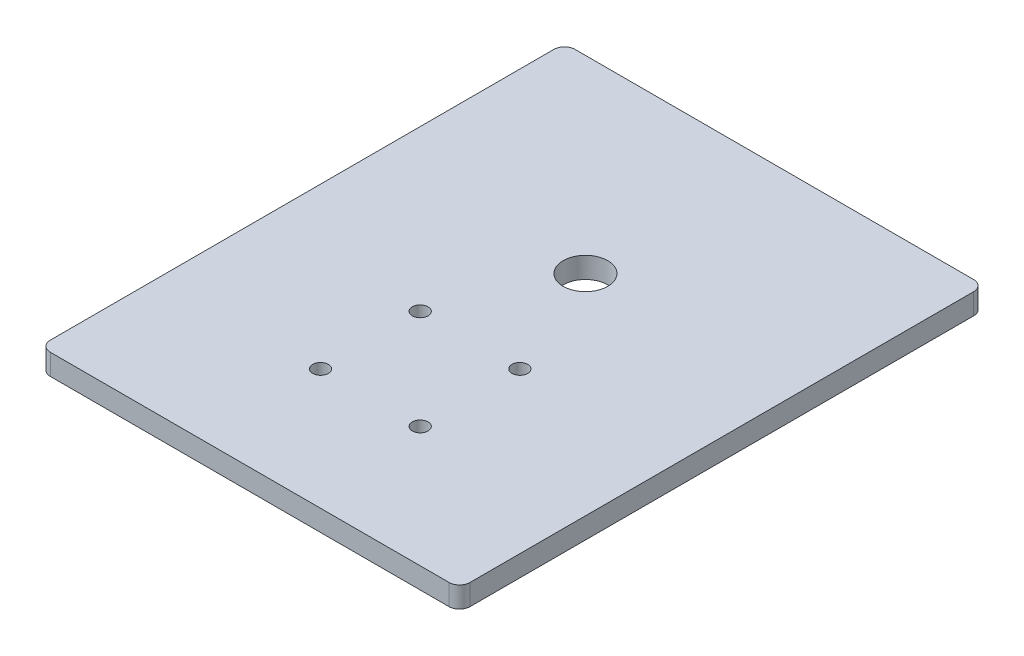
ISO-10303-21;
HEADER;
FILE_DESCRIPTION(('STEP AP214'),'2;1');
FILE_NAME('part.step','',(''),(''),'','','');
FILE_SCHEMA(('AUTOMOTIVE_DESIGN { 1 0 10303 214 1 1 1 1 }'));
ENDSEC;
DATA;
#1=APPLICATION_CONTEXT('core data for automotive mechanical design processes');
#2=APPLICATION_PROTOCOL_DEFINITION('international standard','automotive_design',2000,#1);
#3=PRODUCT_CONTEXT('',#1,'mechanical');
#4=PRODUCT('Part','Part','',(#3));
#5=PRODUCT_RELATED_PRODUCT_CATEGORY('part','',(#4));
#6=PRODUCT_DEFINITION_FORMATION('','',#4);
#7=PRODUCT_DEFINITION_CONTEXT('part definition',#1,'design');
#8=PRODUCT_DEFINITION('design','',#6,#7);
#9=PRODUCT_DEFINITION_SHAPE('','',#8);
#10=(LENGTH_UNIT() NAMED_UNIT(*) SI_UNIT(.MILLI.,.METRE.));
#11=(NAMED_UNIT(*) PLANE_ANGLE_UNIT() SI_UNIT($,.RADIAN.));
#12=(NAMED_UNIT(*) SI_UNIT($,.STERADIAN.) SOLID_ANGLE_UNIT());
#13=UNCERTAINTY_MEASURE_WITH_UNIT(LENGTH_MEASURE(1.E-05),#10,'distance_accuracy_value','');
#14=(GEOMETRIC_REPRESENTATION_CONTEXT(3) GLOBAL_UNCERTAINTY_ASSIGNED_CONTEXT((#13)) GLOBAL_UNIT_ASSIGNED_CONTEXT((#10,
#11,#12)) REPRESENTATION_CONTEXT('',''));
#15=CARTESIAN_POINT('',(0.,0.,0.));
#16=DIRECTION('',(0.,0.,1.));
#17=DIRECTION('',(1.,0.,0.));
#18=AXIS2_PLACEMENT_3D('',#15,#16,#17);
#19=CARTESIAN_POINT('',(-80.,-8.,0.));
#20=DIRECTION('',(-1.,0.,0.));
#21=DIRECTION('',(0.,0.,1.));
#22=AXIS2_PLACEMENT_3D('',#19,#20,#21);
#23=PLANE('',#22);
#24=DIRECTION('',(0.,0.,1.));
#25=VECTOR('',#24,1.);
#26=CARTESIAN_POINT('',(-80.,0.,0.));
#27=LINE('',#26,#25);
#28=CARTESIAN_POINT('',(-80.,0.,4.));
#29=VERTEX_POINT('',#28);
#30=CARTESIAN_POINT('',(-79.9999999999999,0.,196.));
#31=VERTEX_POINT('',#30);
#32=EDGE_CURVE('E109',#29,#31,#27,.T.);
#33=ORIENTED_EDGE('',*,*,#32,.F.);
#34=DIRECTION('',(0.,1.,0.));
#35=VECTOR('',#34,1.);
#36=CARTESIAN_POINT('',(-80.,-8.,4.));
#37=LINE('',#36,#35);
#38=CARTESIAN_POINT('',(-80.,-8.,4.));
#39=VERTEX_POINT('',#38);
#40=EDGE_CURVE('E11',#29,#39,#37,.F.);
#41=ORIENTED_EDGE('',*,*,#40,.T.);
#42=DIRECTION('',(0.,0.,1.));
#43=VECTOR('',#42,1.);
#44=CARTESIAN_POINT('',(-80.,-8.,0.));
#45=LINE('',#44,#43);
#46=CARTESIAN_POINT('',(-79.9999999999999,-8.,196.));
#47=VERTEX_POINT('',#46);
#48=EDGE_CURVE('E159',#39,#47,#45,.T.);
#49=ORIENTED_EDGE('',*,*,#48,.T.);
#50=DIRECTION('',(0.,1.,0.));
#51=VECTOR('',#50,1.);
#52=CARTESIAN_POINT('',(-79.9999999999999,-8.,196.));
#53=LINE('',#52,#51);
#54=EDGE_CURVE('E46',#47,#31,#53,.T.);
#55=ORIENTED_EDGE('',*,*,#54,.T.);
#56=EDGE_LOOP('',(#33,#41,#49,#55));
#57=FACE_BOUND('',#56,.T.);
#58=ADVANCED_FACE('F38',(#57),#23,.T.);
#59=CARTESIAN_POINT('',(-80.,-8.,0.));
#60=DIRECTION('',(0.,0.,-1.));
#61=DIRECTION('',(-1.,0.,0.));
#62=AXIS2_PLACEMENT_3D('',#59,#60,#61);
#63=PLANE('',#62);
#64=DIRECTION('',(-1.,0.,0.));
#65=VECTOR('',#64,1.);
#66=CARTESIAN_POINT('',(-80.,0.,0.));
#67=LINE('',#66,#65);
#68=CARTESIAN_POINT('',(76.,0.,0.));
#69=VERTEX_POINT('',#68);
#70=CARTESIAN_POINT('',(-76.,0.,0.));
#71=VERTEX_POINT('',#70);
#72=EDGE_CURVE('E134',#69,#71,#67,.T.);
#73=ORIENTED_EDGE('',*,*,#72,.F.);
#74=DIRECTION('',(0.,1.,0.));
#75=VECTOR('',#74,1.);
#76=CARTESIAN_POINT('',(76.,-8.,0.));
#77=LINE('',#76,#75);
#78=CARTESIAN_POINT('',(76.,-8.,0.));
#79=VERTEX_POINT('',#78);
#80=EDGE_CURVE('E60',#69,#79,#77,.F.);
#81=ORIENTED_EDGE('',*,*,#80,.T.);
#82=DIRECTION('',(-1.,0.,0.));
#83=VECTOR('',#82,1.);
#84=CARTESIAN_POINT('',(-80.,-8.,0.));
#85=LINE('',#84,#83);
#86=CARTESIAN_POINT('',(-76.,-8.,0.));
#87=VERTEX_POINT('',#86);
#88=EDGE_CURVE('E128',#79,#87,#85,.T.);
#89=ORIENTED_EDGE('',*,*,#88,.T.);
#90=DIRECTION('',(0.,1.,0.));
#91=VECTOR('',#90,1.);
#92=CARTESIAN_POINT('',(-76.,-8.,0.));
#93=LINE('',#92,#91);
#94=EDGE_CURVE('E153',#87,#71,#93,.T.);
#95=ORIENTED_EDGE('',*,*,#94,.T.);
#96=EDGE_LOOP('',(#73,#81,#89,#95));
#97=FACE_BOUND('',#96,.T.);
#98=ADVANCED_FACE('F195',(#97),#63,.T.);
#99=CARTESIAN_POINT('',(80.,-8.,0.));
#100=DIRECTION('',(1.,0.,0.));
#101=DIRECTION('',(0.,0.,-1.));
#102=AXIS2_PLACEMENT_3D('',#99,#100,#101);
#103=PLANE('',#102);
#104=DIRECTION('',(0.,0.,-1.));
#105=VECTOR('',#104,1.);
#106=CARTESIAN_POINT('',(80.,0.,0.));
#107=LINE('',#106,#105);
#108=CARTESIAN_POINT('',(80.,0.,196.));
#109=VERTEX_POINT('',#108);
#110=CARTESIAN_POINT('',(80.,0.,3.99999999999997));
#111=VERTEX_POINT('',#110);
#112=EDGE_CURVE('E124',#109,#111,#107,.T.);
#113=ORIENTED_EDGE('',*,*,#112,.F.);
#114=DIRECTION('',(0.,1.,0.));
#115=VECTOR('',#114,1.);
#116=CARTESIAN_POINT('',(80.,-8.,196.));
#117=LINE('',#116,#115);
#118=CARTESIAN_POINT('',(80.,-8.,196.));
#119=VERTEX_POINT('',#118);
#120=EDGE_CURVE('E145',#109,#119,#117,.F.);
#121=ORIENTED_EDGE('',*,*,#120,.T.);
#122=DIRECTION('',(0.,0.,-1.));
#123=VECTOR('',#122,1.);
#124=CARTESIAN_POINT('',(80.,-8.,0.));
#125=LINE('',#124,#123);
#126=CARTESIAN_POINT('',(80.,-8.,3.99999999999997));
#127=VERTEX_POINT('',#126);
#128=EDGE_CURVE('E131',#119,#127,#125,.T.);
#129=ORIENTED_EDGE('',*,*,#128,.T.);
#130=DIRECTION('',(0.,1.,0.));
#131=VECTOR('',#130,1.);
#132=CARTESIAN_POINT('',(80.,-8.,3.99999999999997));
#133=LINE('',#132,#131);
#134=EDGE_CURVE('E142',#127,#111,#133,.T.);
#135=ORIENTED_EDGE('',*,*,#134,.T.);
#136=EDGE_LOOP('',(#113,#121,#129,#135));
#137=FACE_BOUND('',#136,.T.);
#138=ADVANCED_FACE('F175',(#137),#103,.T.);
#139=CARTESIAN_POINT('',(-79.9999999999999,-8.,200.));
#140=DIRECTION('',(0.,0.,1.));
#141=DIRECTION('',(1.,0.,0.));
#142=AXIS2_PLACEMENT_3D('',#139,#140,#141);
#143=PLANE('',#142);
#144=DIRECTION('',(1.,0.,0.));
#145=VECTOR('',#144,1.);
#146=CARTESIAN_POINT('',(-79.9999999999999,-8.,200.));
#147=LINE('',#146,#145);
#148=CARTESIAN_POINT('',(-75.9999999999999,-8.,200.));
#149=VERTEX_POINT('',#148);
#150=CARTESIAN_POINT('',(76.,-8.,200.));
#151=VERTEX_POINT('',#150);
#152=EDGE_CURVE('E160',#149,#151,#147,.T.);
#153=ORIENTED_EDGE('',*,*,#152,.T.);
#154=DIRECTION('',(0.,1.,0.));
#155=VECTOR('',#154,1.);
#156=CARTESIAN_POINT('',(76.,-8.,200.));
#157=LINE('',#156,#155);
#158=CARTESIAN_POINT('',(76.,0.,200.));
#159=VERTEX_POINT('',#158);
#160=EDGE_CURVE('E115',#151,#159,#157,.T.);
#161=ORIENTED_EDGE('',*,*,#160,.T.);
#162=DIRECTION('',(1.,0.,0.));
#163=VECTOR('',#162,1.);
#164=CARTESIAN_POINT('',(-79.9999999999999,0.,200.));
#165=LINE('',#164,#163);
#166=CARTESIAN_POINT('',(-75.9999999999999,0.,200.));
#167=VERTEX_POINT('',#166);
#168=EDGE_CURVE('E107',#167,#159,#165,.T.);
#169=ORIENTED_EDGE('',*,*,#168,.F.);
#170=DIRECTION('',(0.,1.,0.));
#171=VECTOR('',#170,1.);
#172=CARTESIAN_POINT('',(-75.9999999999999,-8.,200.));
#173=LINE('',#172,#171);
#174=EDGE_CURVE('E121',#167,#149,#173,.F.);
#175=ORIENTED_EDGE('',*,*,#174,.T.);
#176=EDGE_LOOP('',(#153,#161,#169,#175));
#177=FACE_BOUND('',#176,.T.);
#178=ADVANCED_FACE('F120',(#177),#143,.T.);
#179=CARTESIAN_POINT('',(0.,-8.,0.));
#180=DIRECTION('',(0.,1.,0.));
#181=DIRECTION('',(0.,0.,1.));
#182=AXIS2_PLACEMENT_3D('',#179,#180,#181);
#183=PLANE('',#182);
#184=CARTESIAN_POINT('',(-18.9999999999996,-8.,154.));
#185=DIRECTION('',(0.,1.,0.));
#186=DIRECTION('',(0.,0.,1.));
#187=AXIS2_PLACEMENT_3D('',#184,#185,#186);
#188=CIRCLE('',#187,2.99999999999999);
#189=CARTESIAN_POINT('',(-18.9999999999996,-8.,157.));
#190=VERTEX_POINT('',#189);
#191=EDGE_CURVE('E251',#190,#190,#188,.T.);
#192=ORIENTED_EDGE('',*,*,#191,.T.);
#193=EDGE_LOOP('',(#192));
#194=FACE_BOUND('',#193,.T.);
#195=CARTESIAN_POINT('',(19.0000000000004,-8.,154.));
#196=DIRECTION('',(0.,1.,0.));
#197=DIRECTION('',(0.,0.,1.));
#198=AXIS2_PLACEMENT_3D('',#195,#196,#197);
#199=CIRCLE('',#198,2.99999999999999);
#200=CARTESIAN_POINT('',(19.0000000000004,-8.,157.));
#201=VERTEX_POINT('',#200);
#202=EDGE_CURVE('E241',#201,#201,#199,.T.);
#203=ORIENTED_EDGE('',*,*,#202,.T.);
#204=EDGE_LOOP('',(#203));
#205=FACE_BOUND('',#204,.T.);
#206=CARTESIAN_POINT('',(19.0000000000001,-8.,116.));
#207=DIRECTION('',(0.,1.,0.));
#208=DIRECTION('',(0.,0.,1.));
#209=AXIS2_PLACEMENT_3D('',#206,#207,#208);
#210=CIRCLE('',#209,2.99999999999999);
#211=CARTESIAN_POINT('',(19.0000000000001,-8.,119.));
#212=VERTEX_POINT('',#211);
#213=EDGE_CURVE('E236',#212,#212,#210,.T.);
#214=ORIENTED_EDGE('',*,*,#213,.T.);
#215=EDGE_LOOP('',(#214));
#216=FACE_BOUND('',#215,.T.);
#217=CARTESIAN_POINT('',(-19.,-8.,116.));
#218=DIRECTION('',(0.,1.,0.));
#219=DIRECTION('',(0.,0.,1.));
#220=AXIS2_PLACEMENT_3D('',#217,#218,#219);
#221=CIRCLE('',#220,3.);
#222=CARTESIAN_POINT('',(-19.,-8.,119.));
#223=VERTEX_POINT('',#222);
#224=EDGE_CURVE('E257',#223,#223,#221,.T.);
#225=ORIENTED_EDGE('',*,*,#224,.T.);
#226=EDGE_LOOP('',(#225));
#227=FACE_BOUND('',#226,.T.);
#228=CARTESIAN_POINT('',(0.,-8.,72.));
#229=DIRECTION('',(0.,1.,0.));
#230=DIRECTION('',(0.,0.,1.));
#231=AXIS2_PLACEMENT_3D('',#228,#229,#230);
#232=CIRCLE('',#231,8.50000000000001);
#233=CARTESIAN_POINT('',(0.,-8.,80.5));
#234=VERTEX_POINT('',#233);
#235=EDGE_CURVE('E170',#234,#234,#232,.T.);
#236=ORIENTED_EDGE('',*,*,#235,.T.);
#237=EDGE_LOOP('',(#236));
#238=FACE_BOUND('',#237,.T.);
#239=ORIENTED_EDGE('',*,*,#128,.F.);
#240=CARTESIAN_POINT('',(76.,-8.,196.));
#241=DIRECTION('',(0.,1.,0.));
#242=DIRECTION('',(0.,0.,1.));
#243=AXIS2_PLACEMENT_3D('',#240,#241,#242);
#244=CIRCLE('',#243,4.);
#245=EDGE_CURVE('E151',#119,#151,#244,.F.);
#246=ORIENTED_EDGE('',*,*,#245,.T.);
#247=ORIENTED_EDGE('',*,*,#152,.F.);
#248=CARTESIAN_POINT('',(-75.9999999999999,-8.,196.));
#249=DIRECTION('',(0.,1.,0.));
#250=DIRECTION('',(0.,0.,1.));
#251=AXIS2_PLACEMENT_3D('',#248,#249,#250);
#252=CIRCLE('',#251,4.);
#253=EDGE_CURVE('E127',#149,#47,#252,.F.);
#254=ORIENTED_EDGE('',*,*,#253,.T.);
#255=ORIENTED_EDGE('',*,*,#48,.F.);
#256=CARTESIAN_POINT('',(-76.,-8.,4.));
#257=DIRECTION('',(0.,1.,0.));
#258=DIRECTION('',(0.,0.,1.));
#259=AXIS2_PLACEMENT_3D('',#256,#257,#258);
#260=CIRCLE('',#259,4.);
#261=EDGE_CURVE('E53',#39,#87,#260,.F.);
#262=ORIENTED_EDGE('',*,*,#261,.T.);
#263=ORIENTED_EDGE('',*,*,#88,.F.);
#264=CARTESIAN_POINT('',(76.,-8.,3.99999999999997));
#265=DIRECTION('',(0.,1.,0.));
#266=DIRECTION('',(0.,0.,1.));
#267=AXIS2_PLACEMENT_3D('',#264,#265,#266);
#268=CIRCLE('',#267,4.);
#269=EDGE_CURVE('E149',#79,#127,#268,.F.);
#270=ORIENTED_EDGE('',*,*,#269,.T.);
#271=EDGE_LOOP('',(#239,#246,#247,#254,#255,#262,#263,#270));
#272=FACE_BOUND('',#271,.T.);
#273=ADVANCED_FACE('F181',(#194,#205,#216,#227,#238,#272),#183,.F.);
#274=CARTESIAN_POINT('',(0.,0.,0.));
#275=DIRECTION('',(0.,1.,0.));
#276=DIRECTION('',(0.,0.,1.));
#277=AXIS2_PLACEMENT_3D('',#274,#275,#276);
#278=PLANE('',#277);
#279=CARTESIAN_POINT('',(-18.9999999999996,0.,154.));
#280=DIRECTION('',(0.,1.,0.));
#281=DIRECTION('',(0.,0.,1.));
#282=AXIS2_PLACEMENT_3D('',#279,#280,#281);
#283=CIRCLE('',#282,2.99999999999999);
#284=CARTESIAN_POINT('',(-18.9999999999996,0.,157.));
#285=VERTEX_POINT('',#284);
#286=EDGE_CURVE('E254',#285,#285,#283,.T.);
#287=ORIENTED_EDGE('',*,*,#286,.F.);
#288=EDGE_LOOP('',(#287));
#289=FACE_BOUND('',#288,.T.);
#290=CARTESIAN_POINT('',(19.0000000000004,0.,154.));
#291=DIRECTION('',(0.,1.,0.));
#292=DIRECTION('',(0.,0.,1.));
#293=AXIS2_PLACEMENT_3D('',#290,#291,#292);
#294=CIRCLE('',#293,2.99999999999999);
#295=CARTESIAN_POINT('',(19.0000000000004,0.,157.));
#296=VERTEX_POINT('',#295);
#297=EDGE_CURVE('E246',#296,#296,#294,.T.);
#298=ORIENTED_EDGE('',*,*,#297,.F.);
#299=EDGE_LOOP('',(#298));
#300=FACE_BOUND('',#299,.T.);
#301=CARTESIAN_POINT('',(19.0000000000001,0.,116.));
#302=DIRECTION('',(0.,1.,0.));
#303=DIRECTION('',(0.,0.,1.));
#304=AXIS2_PLACEMENT_3D('',#301,#302,#303);
#305=CIRCLE('',#304,2.99999999999999);
#306=CARTESIAN_POINT('',(19.0000000000001,0.,119.));
#307=VERTEX_POINT('',#306);
#308=EDGE_CURVE('E239',#307,#307,#305,.T.);
#309=ORIENTED_EDGE('',*,*,#308,.F.);
#310=EDGE_LOOP('',(#309));
#311=FACE_BOUND('',#310,.T.);
#312=CARTESIAN_POINT('',(-19.,0.,116.));
#313=DIRECTION('',(0.,1.,0.));
#314=DIRECTION('',(0.,0.,1.));
#315=AXIS2_PLACEMENT_3D('',#312,#313,#314);
#316=CIRCLE('',#315,3.);
#317=CARTESIAN_POINT('',(-19.,0.,119.));
#318=VERTEX_POINT('',#317);
#319=EDGE_CURVE('E243',#318,#318,#316,.T.);
#320=ORIENTED_EDGE('',*,*,#319,.F.);
#321=EDGE_LOOP('',(#320));
#322=FACE_BOUND('',#321,.T.);
#323=CARTESIAN_POINT('',(0.,0.,72.));
#324=DIRECTION('',(0.,1.,0.));
#325=DIRECTION('',(0.,0.,1.));
#326=AXIS2_PLACEMENT_3D('',#323,#324,#325);
#327=CIRCLE('',#326,8.50000000000001);
#328=CARTESIAN_POINT('',(0.,0.,80.5));
#329=VERTEX_POINT('',#328);
#330=EDGE_CURVE('E165',#329,#329,#327,.T.);
#331=ORIENTED_EDGE('',*,*,#330,.F.);
#332=EDGE_LOOP('',(#331));
#333=FACE_BOUND('',#332,.T.);
#334=ORIENTED_EDGE('',*,*,#168,.T.);
#335=CARTESIAN_POINT('',(76.,0.,196.));
#336=DIRECTION('',(0.,1.,0.));
#337=DIRECTION('',(0.,0.,1.));
#338=AXIS2_PLACEMENT_3D('',#335,#336,#337);
#339=CIRCLE('',#338,4.);
#340=EDGE_CURVE('E140',#159,#109,#339,.T.);
#341=ORIENTED_EDGE('',*,*,#340,.T.);
#342=ORIENTED_EDGE('',*,*,#112,.T.);
#343=CARTESIAN_POINT('',(76.,0.,3.99999999999997));
#344=DIRECTION('',(0.,1.,0.));
#345=DIRECTION('',(0.,0.,1.));
#346=AXIS2_PLACEMENT_3D('',#343,#344,#345);
#347=CIRCLE('',#346,4.);
#348=EDGE_CURVE('E138',#111,#69,#347,.T.);
#349=ORIENTED_EDGE('',*,*,#348,.T.);
#350=ORIENTED_EDGE('',*,*,#72,.T.);
#351=CARTESIAN_POINT('',(-76.,0.,4.));
#352=DIRECTION('',(0.,1.,0.));
#353=DIRECTION('',(0.,0.,1.));
#354=AXIS2_PLACEMENT_3D('',#351,#352,#353);
#355=CIRCLE('',#354,4.);
#356=EDGE_CURVE('E114',#71,#29,#355,.T.);
#357=ORIENTED_EDGE('',*,*,#356,.T.);
#358=ORIENTED_EDGE('',*,*,#32,.T.);
#359=CARTESIAN_POINT('',(-75.9999999999999,0.,196.));
#360=DIRECTION('',(0.,1.,0.));
#361=DIRECTION('',(0.,0.,1.));
#362=AXIS2_PLACEMENT_3D('',#359,#360,#361);
#363=CIRCLE('',#362,4.);
#364=EDGE_CURVE('E104',#31,#167,#363,.T.);
#365=ORIENTED_EDGE('',*,*,#364,.T.);
#366=EDGE_LOOP('',(#334,#341,#342,#349,#350,#357,#358,#365));
#367=FACE_BOUND('',#366,.T.);
#368=ADVANCED_FACE('F106',(#289,#300,#311,#322,#333,#367),#278,.T.);
#369=CARTESIAN_POINT('',(76.,-8.,196.));
#370=DIRECTION('',(0.,1.,0.));
#371=DIRECTION('',(0.,0.,1.));
#372=AXIS2_PLACEMENT_3D('',#369,#370,#371);
#373=CYLINDRICAL_SURFACE('',#372,4.);
#374=ORIENTED_EDGE('',*,*,#245,.F.);
#375=ORIENTED_EDGE('',*,*,#120,.F.);
#376=ORIENTED_EDGE('',*,*,#340,.F.);
#377=ORIENTED_EDGE('',*,*,#160,.F.);
#378=EDGE_LOOP('',(#374,#375,#376,#377));
#379=FACE_BOUND('',#378,.T.);
#380=ADVANCED_FACE('F180',(#379),#373,.T.);
#381=CARTESIAN_POINT('',(76.,-8.,3.99999999999997));
#382=DIRECTION('',(0.,1.,0.));
#383=DIRECTION('',(0.,0.,1.));
#384=AXIS2_PLACEMENT_3D('',#381,#382,#383);
#385=CYLINDRICAL_SURFACE('',#384,4.);
#386=ORIENTED_EDGE('',*,*,#269,.F.);
#387=ORIENTED_EDGE('',*,*,#80,.F.);
#388=ORIENTED_EDGE('',*,*,#348,.F.);
#389=ORIENTED_EDGE('',*,*,#134,.F.);
#390=EDGE_LOOP('',(#386,#387,#388,#389));
#391=FACE_BOUND('',#390,.T.);
#392=ADVANCED_FACE('F184',(#391),#385,.T.);
#393=CARTESIAN_POINT('',(-76.,-8.,4.));
#394=DIRECTION('',(0.,1.,0.));
#395=DIRECTION('',(0.,0.,1.));
#396=AXIS2_PLACEMENT_3D('',#393,#394,#395);
#397=CYLINDRICAL_SURFACE('',#396,4.);
#398=ORIENTED_EDGE('',*,*,#261,.F.);
#399=ORIENTED_EDGE('',*,*,#40,.F.);
#400=ORIENTED_EDGE('',*,*,#356,.F.);
#401=ORIENTED_EDGE('',*,*,#94,.F.);
#402=EDGE_LOOP('',(#398,#399,#400,#401));
#403=FACE_BOUND('',#402,.T.);
#404=ADVANCED_FACE('F186',(#403),#397,.T.);
#405=CARTESIAN_POINT('',(-75.9999999999999,-8.,196.));
#406=DIRECTION('',(0.,1.,0.));
#407=DIRECTION('',(0.,0.,1.));
#408=AXIS2_PLACEMENT_3D('',#405,#406,#407);
#409=CYLINDRICAL_SURFACE('',#408,4.);
#410=ORIENTED_EDGE('',*,*,#253,.F.);
#411=ORIENTED_EDGE('',*,*,#174,.F.);
#412=ORIENTED_EDGE('',*,*,#364,.F.);
#413=ORIENTED_EDGE('',*,*,#54,.F.);
#414=EDGE_LOOP('',(#410,#411,#412,#413));
#415=FACE_BOUND('',#414,.T.);
#416=ADVANCED_FACE('F40',(#415),#409,.T.);
#417=CARTESIAN_POINT('',(0.,-8.,72.));
#418=DIRECTION('',(0.,1.,0.));
#419=DIRECTION('',(0.,0.,1.));
#420=AXIS2_PLACEMENT_3D('',#417,#418,#419);
#421=CYLINDRICAL_SURFACE('',#420,8.50000000000001);
#422=ORIENTED_EDGE('',*,*,#235,.F.);
#423=EDGE_LOOP('',(#422));
#424=FACE_BOUND('',#423,.T.);
#425=ORIENTED_EDGE('',*,*,#330,.T.);
#426=EDGE_LOOP('',(#425));
#427=FACE_BOUND('',#426,.T.);
#428=ADVANCED_FACE('F212',(#424,#427),#421,.F.);
#429=CARTESIAN_POINT('',(-19.,-8.,116.));
#430=DIRECTION('',(0.,1.,0.));
#431=DIRECTION('',(0.,0.,1.));
#432=AXIS2_PLACEMENT_3D('',#429,#430,#431);
#433=CYLINDRICAL_SURFACE('',#432,3.);
#434=ORIENTED_EDGE('',*,*,#224,.F.);
#435=EDGE_LOOP('',(#434));
#436=FACE_BOUND('',#435,.T.);
#437=ORIENTED_EDGE('',*,*,#319,.T.);
#438=EDGE_LOOP('',(#437));
#439=FACE_BOUND('',#438,.T.);
#440=ADVANCED_FACE('F215',(#436,#439),#433,.F.);
#441=CARTESIAN_POINT('',(19.0000000000001,-8.,116.));
#442=DIRECTION('',(0.,1.,0.));
#443=DIRECTION('',(0.,0.,1.));
#444=AXIS2_PLACEMENT_3D('',#441,#442,#443);
#445=CYLINDRICAL_SURFACE('',#444,2.99999999999999);
#446=ORIENTED_EDGE('',*,*,#213,.F.);
#447=EDGE_LOOP('',(#446));
#448=FACE_BOUND('',#447,.T.);
#449=ORIENTED_EDGE('',*,*,#308,.T.);
#450=EDGE_LOOP('',(#449));
#451=FACE_BOUND('',#450,.T.);
#452=ADVANCED_FACE('F219',(#448,#451),#445,.F.);
#453=CARTESIAN_POINT('',(19.0000000000004,-8.,154.));
#454=DIRECTION('',(0.,1.,0.));
#455=DIRECTION('',(0.,0.,1.));
#456=AXIS2_PLACEMENT_3D('',#453,#454,#455);
#457=CYLINDRICAL_SURFACE('',#456,2.99999999999999);
#458=ORIENTED_EDGE('',*,*,#202,.F.);
#459=EDGE_LOOP('',(#458));
#460=FACE_BOUND('',#459,.T.);
#461=ORIENTED_EDGE('',*,*,#297,.T.);
#462=EDGE_LOOP('',(#461));
#463=FACE_BOUND('',#462,.T.);
#464=ADVANCED_FACE('F224',(#460,#463),#457,.F.);
#465=CARTESIAN_POINT('',(-18.9999999999996,-8.,154.));
#466=DIRECTION('',(0.,1.,0.));
#467=DIRECTION('',(0.,0.,1.));
#468=AXIS2_PLACEMENT_3D('',#465,#466,#467);
#469=CYLINDRICAL_SURFACE('',#468,2.99999999999999);
#470=ORIENTED_EDGE('',*,*,#191,.F.);
#471=EDGE_LOOP('',(#470));
#472=FACE_BOUND('',#471,.T.);
#473=ORIENTED_EDGE('',*,*,#286,.T.);
#474=EDGE_LOOP('',(#473));
#475=FACE_BOUND('',#474,.T.);
#476=ADVANCED_FACE('F221',(#472,#475),#469,.F.);
#477=CLOSED_SHELL('',(#58,#98,#138,#178,#273,#368,#380,#392,#404,#416,#428,#440,#452,#464,#476));
#478=MANIFOLD_SOLID_BREP('B2',#477);
#479=ADVANCED_BREP_SHAPE_REPRESENTATION('',(#18,#478),#14);
#480=SHAPE_DEFINITION_REPRESENTATION(#9,#479);
ENDSEC;
END-ISO-10303-21;
